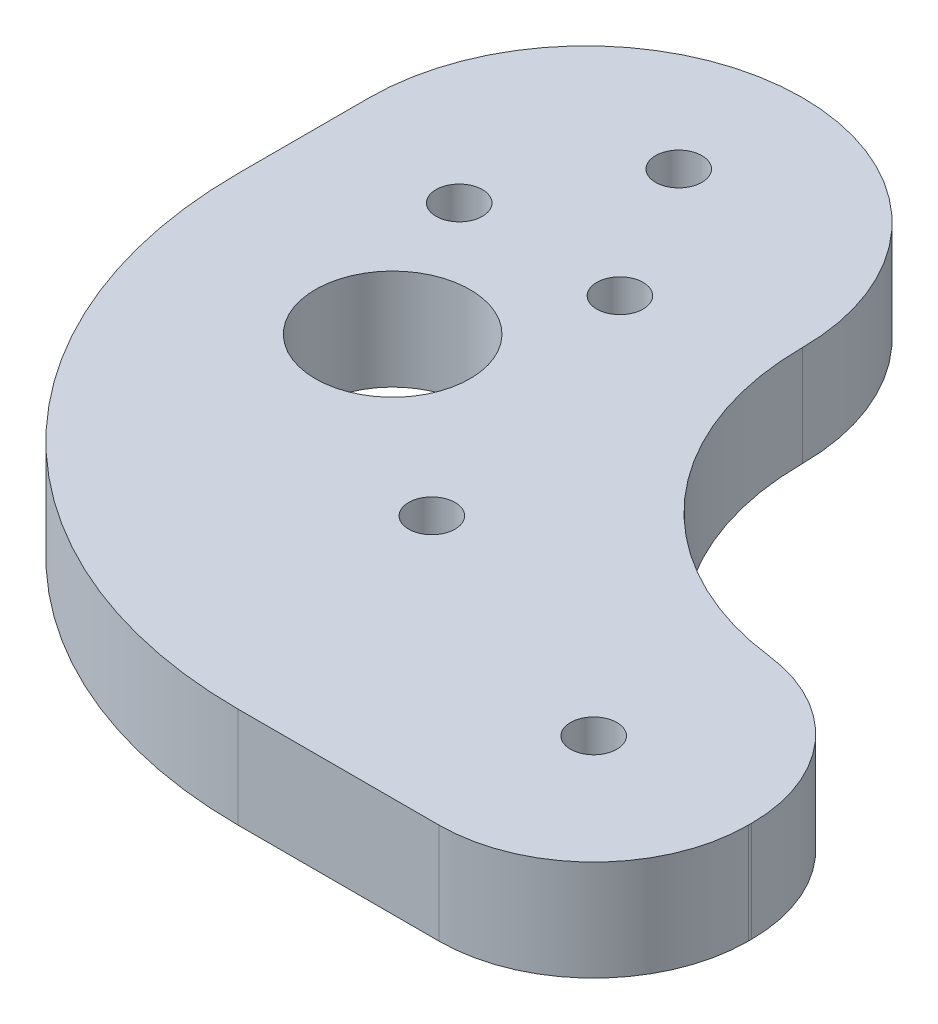
ISO-10303-21;
HEADER;
FILE_DESCRIPTION(('STEP AP214'),'2;1');
FILE_NAME('part.step','',(''),(''),'','','');
FILE_SCHEMA(('AUTOMOTIVE_DESIGN { 1 0 10303 214 1 1 1 1 }'));
ENDSEC;
DATA;
#1=APPLICATION_CONTEXT('core data for automotive mechanical design processes');
#2=APPLICATION_PROTOCOL_DEFINITION('international standard','automotive_design',2000,#1);
#3=PRODUCT_CONTEXT('',#1,'mechanical');
#4=PRODUCT('Part','Part','',(#3));
#5=PRODUCT_RELATED_PRODUCT_CATEGORY('part','',(#4));
#6=PRODUCT_DEFINITION_FORMATION('','',#4);
#7=PRODUCT_DEFINITION_CONTEXT('part definition',#1,'design');
#8=PRODUCT_DEFINITION('design','',#6,#7);
#9=PRODUCT_DEFINITION_SHAPE('','',#8);
#10=(LENGTH_UNIT() NAMED_UNIT(*) SI_UNIT(.MILLI.,.METRE.));
#11=(NAMED_UNIT(*) PLANE_ANGLE_UNIT() SI_UNIT($,.RADIAN.));
#12=(NAMED_UNIT(*) SI_UNIT($,.STERADIAN.) SOLID_ANGLE_UNIT());
#13=UNCERTAINTY_MEASURE_WITH_UNIT(LENGTH_MEASURE(1.E-05),#10,'distance_accuracy_value','');
#14=(GEOMETRIC_REPRESENTATION_CONTEXT(3) GLOBAL_UNCERTAINTY_ASSIGNED_CONTEXT((#13)) GLOBAL_UNIT_ASSIGNED_CONTEXT((#10,
#11,#12)) REPRESENTATION_CONTEXT('',''));
#15=CARTESIAN_POINT('',(0.,0.,0.));
#16=DIRECTION('',(0.,0.,1.));
#17=DIRECTION('',(1.,0.,0.));
#18=AXIS2_PLACEMENT_3D('',#15,#16,#17);
#19=CARTESIAN_POINT('',(14.,0.,-38.5));
#20=DIRECTION('',(0.,1.,0.));
#21=DIRECTION('',(0.,0.,1.));
#22=AXIS2_PLACEMENT_3D('',#19,#20,#21);
#23=PLANE('',#22);
#24=CARTESIAN_POINT('',(19.196152422707,0.,-35.5000000000002));
#25=DIRECTION('',(0.,1.,0.));
#26=DIRECTION('',(0.,0.,1.));
#27=AXIS2_PLACEMENT_3D('',#24,#25,#26);
#28=CIRCLE('',#27,1.50000000000012);
#29=CARTESIAN_POINT('',(19.196152422707,0.,-34.0000000000001));
#30=VERTEX_POINT('',#29);
#31=EDGE_CURVE('E136',#30,#30,#28,.T.);
#32=ORIENTED_EDGE('',*,*,#31,.T.);
#33=EDGE_LOOP('',(#32));
#34=FACE_BOUND('',#33,.T.);
#35=CARTESIAN_POINT('',(43.,0.,-10.));
#36=DIRECTION('',(0.,1.,0.));
#37=DIRECTION('',(0.,0.,1.));
#38=AXIS2_PLACEMENT_3D('',#35,#36,#37);
#39=CIRCLE('',#38,1.5);
#40=CARTESIAN_POINT('',(43.,0.,-8.49999999999999));
#41=VERTEX_POINT('',#40);
#42=EDGE_CURVE('E142',#41,#41,#39,.T.);
#43=ORIENTED_EDGE('',*,*,#42,.T.);
#44=EDGE_LOOP('',(#43));
#45=FACE_BOUND('',#44,.T.);
#46=CARTESIAN_POINT('',(14.,0.,-44.5));
#47=DIRECTION('',(0.,1.,0.));
#48=DIRECTION('',(0.,0.,1.));
#49=AXIS2_PLACEMENT_3D('',#46,#47,#48);
#50=CIRCLE('',#49,1.5);
#51=CARTESIAN_POINT('',(14.,0.,-43.));
#52=VERTEX_POINT('',#51);
#53=EDGE_CURVE('E148',#52,#52,#50,.T.);
#54=ORIENTED_EDGE('',*,*,#53,.T.);
#55=EDGE_LOOP('',(#54));
#56=FACE_BOUND('',#55,.T.);
#57=DIRECTION('',(1.,0.,0.));
#58=VECTOR('',#57,1.);
#59=CARTESIAN_POINT('',(0.,0.,0.));
#60=LINE('',#59,#58);
#61=CARTESIAN_POINT('',(30.,0.,0.));
#62=VERTEX_POINT('',#61);
#63=CARTESIAN_POINT('',(43.,0.,0.));
#64=VERTEX_POINT('',#63);
#65=EDGE_CURVE('E154',#62,#64,#60,.T.);
#66=ORIENTED_EDGE('',*,*,#65,.F.);
#67=CARTESIAN_POINT('',(30.,0.,-30.));
#68=DIRECTION('',(0.,1.,0.));
#69=DIRECTION('',(0.,0.,1.));
#70=AXIS2_PLACEMENT_3D('',#67,#68,#69);
#71=CIRCLE('',#70,30.);
#72=CARTESIAN_POINT('',(0.,0.,-30.));
#73=VERTEX_POINT('',#72);
#74=EDGE_CURVE('E57',#62,#73,#71,.F.);
#75=ORIENTED_EDGE('',*,*,#74,.T.);
#76=DIRECTION('',(0.,0.,1.));
#77=VECTOR('',#76,1.);
#78=CARTESIAN_POINT('',(0.,0.,-38.5));
#79=LINE('',#78,#77);
#80=CARTESIAN_POINT('',(0.,0.,-38.5));
#81=VERTEX_POINT('',#80);
#82=EDGE_CURVE('E152',#81,#73,#79,.T.);
#83=ORIENTED_EDGE('',*,*,#82,.F.);
#84=CARTESIAN_POINT('',(14.,0.,-38.5));
#85=DIRECTION('',(0.,1.,0.));
#86=DIRECTION('',(0.,0.,1.));
#87=AXIS2_PLACEMENT_3D('',#84,#85,#86);
#88=CIRCLE('',#87,14.);
#89=CARTESIAN_POINT('',(28.,0.,-38.5));
#90=VERTEX_POINT('',#89);
#91=EDGE_CURVE('E106',#90,#81,#88,.T.);
#92=ORIENTED_EDGE('',*,*,#91,.F.);
#93=CARTESIAN_POINT('',(46.5,0.,-38.5));
#94=DIRECTION('',(0.,-1.,0.));
#95=DIRECTION('',(0.,0.,1.));
#96=AXIS2_PLACEMENT_3D('',#93,#94,#95);
#97=CIRCLE('',#96,18.5);
#98=CARTESIAN_POINT('',(44.2280701754386,0.,-20.1400344534019));
#99=VERTEX_POINT('',#98);
#100=EDGE_CURVE('E159',#99,#90,#97,.T.);
#101=ORIENTED_EDGE('',*,*,#100,.F.);
#102=CARTESIAN_POINT('',(43.,0.,-10.2157287525381));
#103=DIRECTION('',(0.,1.,0.));
#104=DIRECTION('',(0.,0.,1.));
#105=AXIS2_PLACEMENT_3D('',#102,#103,#104);
#106=CIRCLE('',#105,10.);
#107=CARTESIAN_POINT('',(53.,0.,-10.2157287525381));
#108=VERTEX_POINT('',#107);
#109=EDGE_CURVE('E175',#99,#108,#106,.F.);
#110=ORIENTED_EDGE('',*,*,#109,.T.);
#111=DIRECTION('',(0.,0.,-1.));
#112=VECTOR('',#111,1.);
#113=CARTESIAN_POINT('',(53.,0.,0.));
#114=LINE('',#113,#112);
#115=CARTESIAN_POINT('',(53.,0.,-10.));
#116=VERTEX_POINT('',#115);
#117=EDGE_CURVE('E156',#116,#108,#114,.T.);
#118=ORIENTED_EDGE('',*,*,#117,.F.);
#119=CARTESIAN_POINT('',(43.,0.,-10.));
#120=DIRECTION('',(0.,1.,0.));
#121=DIRECTION('',(0.,0.,1.));
#122=AXIS2_PLACEMENT_3D('',#119,#120,#121);
#123=CIRCLE('',#122,10.);
#124=EDGE_CURVE('E164',#116,#64,#123,.F.);
#125=ORIENTED_EDGE('',*,*,#124,.T.);
#126=EDGE_LOOP('',(#66,#75,#83,#92,#101,#110,#118,#125));
#127=FACE_BOUND('',#126,.T.);
#128=CARTESIAN_POINT('',(25.4412219618611,0.,-17.0931457505077));
#129=DIRECTION('',(0.,1.,0.));
#130=DIRECTION('',(0.,0.,1.));
#131=AXIS2_PLACEMENT_3D('',#128,#129,#130);
#132=CIRCLE('',#131,1.5);
#133=CARTESIAN_POINT('',(25.4412219618611,0.,-15.5931457505077));
#134=VERTEX_POINT('',#133);
#135=EDGE_CURVE('E145',#134,#134,#132,.T.);
#136=ORIENTED_EDGE('',*,*,#135,.T.);
#137=EDGE_LOOP('',(#136));
#138=FACE_BOUND('',#137,.T.);
#139=CARTESIAN_POINT('',(14.,0.,-26.));
#140=DIRECTION('',(0.,1.,0.));
#141=DIRECTION('',(0.,0.,1.));
#142=AXIS2_PLACEMENT_3D('',#139,#140,#141);
#143=CIRCLE('',#142,5.);
#144=CARTESIAN_POINT('',(14.,0.,-21.));
#145=VERTEX_POINT('',#144);
#146=EDGE_CURVE('E139',#145,#145,#143,.T.);
#147=ORIENTED_EDGE('',*,*,#146,.T.);
#148=EDGE_LOOP('',(#147));
#149=FACE_BOUND('',#148,.T.);
#150=CARTESIAN_POINT('',(8.80384757729372,0.,-35.4999999999998));
#151=DIRECTION('',(0.,1.,0.));
#152=DIRECTION('',(0.,0.,1.));
#153=AXIS2_PLACEMENT_3D('',#150,#151,#152);
#154=CIRCLE('',#153,1.50000000000001);
#155=CARTESIAN_POINT('',(8.80384757729372,0.,-33.9999999999998));
#156=VERTEX_POINT('',#155);
#157=EDGE_CURVE('E133',#156,#156,#154,.T.);
#158=ORIENTED_EDGE('',*,*,#157,.T.);
#159=EDGE_LOOP('',(#158));
#160=FACE_BOUND('',#159,.T.);
#161=ADVANCED_FACE('F35',(#34,#45,#56,#127,#138,#149,#160),#23,.F.);
#162=CARTESIAN_POINT('',(14.,3.5,-38.5));
#163=DIRECTION('',(0.,-1.,0.));
#164=DIRECTION('',(0.,0.,-1.));
#165=AXIS2_PLACEMENT_3D('',#162,#163,#164);
#166=CYLINDRICAL_SURFACE('',#165,14.);
#167=ORIENTED_EDGE('',*,*,#91,.T.);
#168=DIRECTION('',(0.,-1.,0.));
#169=VECTOR('',#168,1.);
#170=CARTESIAN_POINT('',(0.,3.5,-38.5));
#171=LINE('',#170,#169);
#172=CARTESIAN_POINT('',(0.,6.5,-38.5));
#173=VERTEX_POINT('',#172);
#174=EDGE_CURVE('E100',#173,#81,#171,.T.);
#175=ORIENTED_EDGE('',*,*,#174,.F.);
#176=CARTESIAN_POINT('',(14.,6.5,-38.5));
#177=DIRECTION('',(0.,1.,0.));
#178=DIRECTION('',(0.,0.,1.));
#179=AXIS2_PLACEMENT_3D('',#176,#177,#178);
#180=CIRCLE('',#179,14.);
#181=CARTESIAN_POINT('',(28.,6.5,-38.5));
#182=VERTEX_POINT('',#181);
#183=EDGE_CURVE('E104',#182,#173,#180,.T.);
#184=ORIENTED_EDGE('',*,*,#183,.F.);
#185=DIRECTION('',(0.,-1.,0.));
#186=VECTOR('',#185,1.);
#187=CARTESIAN_POINT('',(28.,3.5,-38.5));
#188=LINE('',#187,#186);
#189=EDGE_CURVE('E108',#182,#90,#188,.T.);
#190=ORIENTED_EDGE('',*,*,#189,.T.);
#191=EDGE_LOOP('',(#167,#175,#184,#190));
#192=FACE_BOUND('',#191,.T.);
#193=ADVANCED_FACE('F101',(#192),#166,.T.);
#194=CARTESIAN_POINT('',(0.,3.5,-38.5));
#195=DIRECTION('',(1.,0.,0.));
#196=DIRECTION('',(0.,0.,-1.));
#197=AXIS2_PLACEMENT_3D('',#194,#195,#196);
#198=PLANE('',#197);
#199=ORIENTED_EDGE('',*,*,#82,.T.);
#200=DIRECTION('',(0.,-1.,0.));
#201=VECTOR('',#200,1.);
#202=CARTESIAN_POINT('',(0.,3.5,-30.));
#203=LINE('',#202,#201);
#204=CARTESIAN_POINT('',(0.,6.5,-30.));
#205=VERTEX_POINT('',#204);
#206=EDGE_CURVE('E43',#73,#205,#203,.F.);
#207=ORIENTED_EDGE('',*,*,#206,.T.);
#208=DIRECTION('',(0.,0.,1.));
#209=VECTOR('',#208,1.);
#210=CARTESIAN_POINT('',(0.,6.5,-38.5));
#211=LINE('',#210,#209);
#212=EDGE_CURVE('E110',#173,#205,#211,.T.);
#213=ORIENTED_EDGE('',*,*,#212,.F.);
#214=ORIENTED_EDGE('',*,*,#174,.T.);
#215=EDGE_LOOP('',(#199,#207,#213,#214));
#216=FACE_BOUND('',#215,.T.);
#217=ADVANCED_FACE('F111',(#216),#198,.F.);
#218=CARTESIAN_POINT('',(0.,3.5,0.));
#219=DIRECTION('',(0.,0.,-1.));
#220=DIRECTION('',(-1.,0.,0.));
#221=AXIS2_PLACEMENT_3D('',#218,#219,#220);
#222=PLANE('',#221);
#223=DIRECTION('',(1.,0.,0.));
#224=VECTOR('',#223,1.);
#225=CARTESIAN_POINT('',(0.,6.5,0.));
#226=LINE('',#225,#224);
#227=CARTESIAN_POINT('',(30.,6.5,0.));
#228=VERTEX_POINT('',#227);
#229=CARTESIAN_POINT('',(43.,6.5,0.));
#230=VERTEX_POINT('',#229);
#231=EDGE_CURVE('E114',#228,#230,#226,.T.);
#232=ORIENTED_EDGE('',*,*,#231,.F.);
#233=DIRECTION('',(0.,-1.,0.));
#234=VECTOR('',#233,1.);
#235=CARTESIAN_POINT('',(30.,3.5,0.));
#236=LINE('',#235,#234);
#237=EDGE_CURVE('E181',#228,#62,#236,.T.);
#238=ORIENTED_EDGE('',*,*,#237,.T.);
#239=ORIENTED_EDGE('',*,*,#65,.T.);
#240=DIRECTION('',(0.,-1.,0.));
#241=VECTOR('',#240,1.);
#242=CARTESIAN_POINT('',(43.,3.5,0.));
#243=LINE('',#242,#241);
#244=EDGE_CURVE('E167',#64,#230,#243,.F.);
#245=ORIENTED_EDGE('',*,*,#244,.T.);
#246=EDGE_LOOP('',(#232,#238,#239,#245));
#247=FACE_BOUND('',#246,.T.);
#248=ADVANCED_FACE('F187',(#247),#222,.F.);
#249=CARTESIAN_POINT('',(53.,3.5,0.));
#250=DIRECTION('',(-1.,0.,0.));
#251=DIRECTION('',(0.,0.,1.));
#252=AXIS2_PLACEMENT_3D('',#249,#250,#251);
#253=PLANE('',#252);
#254=ORIENTED_EDGE('',*,*,#117,.T.);
#255=DIRECTION('',(0.,-1.,0.));
#256=VECTOR('',#255,1.);
#257=CARTESIAN_POINT('',(53.,3.5,-10.2157287525381));
#258=LINE('',#257,#256);
#259=CARTESIAN_POINT('',(53.,6.5,-10.2157287525381));
#260=VERTEX_POINT('',#259);
#261=EDGE_CURVE('E177',#108,#260,#258,.F.);
#262=ORIENTED_EDGE('',*,*,#261,.T.);
#263=DIRECTION('',(0.,0.,-1.));
#264=VECTOR('',#263,1.);
#265=CARTESIAN_POINT('',(53.,6.5,0.));
#266=LINE('',#265,#264);
#267=CARTESIAN_POINT('',(53.,6.5,-10.));
#268=VERTEX_POINT('',#267);
#269=EDGE_CURVE('E129',#268,#260,#266,.T.);
#270=ORIENTED_EDGE('',*,*,#269,.F.);
#271=DIRECTION('',(0.,-1.,0.));
#272=VECTOR('',#271,1.);
#273=CARTESIAN_POINT('',(53.,3.5,-10.));
#274=LINE('',#273,#272);
#275=EDGE_CURVE('E107',#268,#116,#274,.T.);
#276=ORIENTED_EDGE('',*,*,#275,.T.);
#277=EDGE_LOOP('',(#254,#262,#270,#276));
#278=FACE_BOUND('',#277,.T.);
#279=ADVANCED_FACE('F199',(#278),#253,.F.);
#280=CARTESIAN_POINT('',(46.5,3.5,-38.5));
#281=DIRECTION('',(0.,-1.,0.));
#282=DIRECTION('',(0.,0.,-1.));
#283=AXIS2_PLACEMENT_3D('',#280,#281,#282);
#284=CYLINDRICAL_SURFACE('',#283,18.5);
#285=CARTESIAN_POINT('',(46.5,6.5,-38.5));
#286=DIRECTION('',(0.,-1.,0.));
#287=DIRECTION('',(0.,0.,1.));
#288=AXIS2_PLACEMENT_3D('',#285,#286,#287);
#289=CIRCLE('',#288,18.5);
#290=CARTESIAN_POINT('',(44.2280701754386,6.5,-20.1400344534019));
#291=VERTEX_POINT('',#290);
#292=EDGE_CURVE('E119',#291,#182,#289,.T.);
#293=ORIENTED_EDGE('',*,*,#292,.F.);
#294=DIRECTION('',(0.,-1.,0.));
#295=VECTOR('',#294,1.);
#296=CARTESIAN_POINT('',(44.2280701754386,3.5,-20.1400344534019));
#297=LINE('',#296,#295);
#298=EDGE_CURVE('E172',#291,#99,#297,.T.);
#299=ORIENTED_EDGE('',*,*,#298,.T.);
#300=ORIENTED_EDGE('',*,*,#100,.T.);
#301=ORIENTED_EDGE('',*,*,#189,.F.);
#302=EDGE_LOOP('',(#293,#299,#300,#301));
#303=FACE_BOUND('',#302,.T.);
#304=ADVANCED_FACE('F205',(#303),#284,.F.);
#305=CARTESIAN_POINT('',(14.,3.5,-44.5));
#306=DIRECTION('',(0.,-1.,0.));
#307=DIRECTION('',(0.,0.,-1.));
#308=AXIS2_PLACEMENT_3D('',#305,#306,#307);
#309=CYLINDRICAL_SURFACE('',#308,1.5);
#310=ORIENTED_EDGE('',*,*,#53,.F.);
#311=EDGE_LOOP('',(#310));
#312=FACE_BOUND('',#311,.T.);
#313=CARTESIAN_POINT('',(14.,6.5,-44.5));
#314=DIRECTION('',(0.,1.,0.));
#315=DIRECTION('',(0.,0.,1.));
#316=AXIS2_PLACEMENT_3D('',#313,#314,#315);
#317=CIRCLE('',#316,1.5);
#318=CARTESIAN_POINT('',(14.,6.5,-43.));
#319=VERTEX_POINT('',#318);
#320=EDGE_CURVE('E121',#319,#319,#317,.T.);
#321=ORIENTED_EDGE('',*,*,#320,.T.);
#322=EDGE_LOOP('',(#321));
#323=FACE_BOUND('',#322,.T.);
#324=ADVANCED_FACE('F221',(#312,#323),#309,.F.);
#325=CARTESIAN_POINT('',(25.4412219618611,3.5,-17.0931457505077));
#326=DIRECTION('',(0.,-1.,0.));
#327=DIRECTION('',(0.,0.,-1.));
#328=AXIS2_PLACEMENT_3D('',#325,#326,#327);
#329=CYLINDRICAL_SURFACE('',#328,1.5);
#330=ORIENTED_EDGE('',*,*,#135,.F.);
#331=EDGE_LOOP('',(#330));
#332=FACE_BOUND('',#331,.T.);
#333=CARTESIAN_POINT('',(25.4412219618611,6.5,-17.0931457505077));
#334=DIRECTION('',(0.,1.,0.));
#335=DIRECTION('',(0.,0.,1.));
#336=AXIS2_PLACEMENT_3D('',#333,#334,#335);
#337=CIRCLE('',#336,1.5);
#338=CARTESIAN_POINT('',(25.4412219618611,6.5,-15.5931457505077));
#339=VERTEX_POINT('',#338);
#340=EDGE_CURVE('E124',#339,#339,#337,.T.);
#341=ORIENTED_EDGE('',*,*,#340,.T.);
#342=EDGE_LOOP('',(#341));
#343=FACE_BOUND('',#342,.T.);
#344=ADVANCED_FACE('F256',(#332,#343),#329,.F.);
#345=CARTESIAN_POINT('',(43.,3.5,-10.));
#346=DIRECTION('',(0.,-1.,0.));
#347=DIRECTION('',(0.,0.,-1.));
#348=AXIS2_PLACEMENT_3D('',#345,#346,#347);
#349=CYLINDRICAL_SURFACE('',#348,1.5);
#350=ORIENTED_EDGE('',*,*,#42,.F.);
#351=EDGE_LOOP('',(#350));
#352=FACE_BOUND('',#351,.T.);
#353=CARTESIAN_POINT('',(43.,6.5,-10.));
#354=DIRECTION('',(0.,1.,0.));
#355=DIRECTION('',(0.,0.,1.));
#356=AXIS2_PLACEMENT_3D('',#353,#354,#355);
#357=CIRCLE('',#356,1.5);
#358=CARTESIAN_POINT('',(43.,6.5,-8.49999999999999));
#359=VERTEX_POINT('',#358);
#360=EDGE_CURVE('E268',#359,#359,#357,.T.);
#361=ORIENTED_EDGE('',*,*,#360,.T.);
#362=EDGE_LOOP('',(#361));
#363=FACE_BOUND('',#362,.T.);
#364=ADVANCED_FACE('F253',(#352,#363),#349,.F.);
#365=CARTESIAN_POINT('',(14.,3.5,-26.));
#366=DIRECTION('',(0.,-1.,0.));
#367=DIRECTION('',(0.,0.,-1.));
#368=AXIS2_PLACEMENT_3D('',#365,#366,#367);
#369=CYLINDRICAL_SURFACE('',#368,5.);
#370=ORIENTED_EDGE('',*,*,#146,.F.);
#371=EDGE_LOOP('',(#370));
#372=FACE_BOUND('',#371,.T.);
#373=CARTESIAN_POINT('',(14.,6.5,-26.));
#374=DIRECTION('',(0.,1.,0.));
#375=DIRECTION('',(0.,0.,1.));
#376=AXIS2_PLACEMENT_3D('',#373,#374,#375);
#377=CIRCLE('',#376,5.);
#378=CARTESIAN_POINT('',(14.,6.5,-21.));
#379=VERTEX_POINT('',#378);
#380=EDGE_CURVE('E270',#379,#379,#377,.T.);
#381=ORIENTED_EDGE('',*,*,#380,.T.);
#382=EDGE_LOOP('',(#381));
#383=FACE_BOUND('',#382,.T.);
#384=ADVANCED_FACE('F249',(#372,#383),#369,.F.);
#385=CARTESIAN_POINT('',(19.196152422707,3.5,-35.5000000000002));
#386=DIRECTION('',(0.,-1.,0.));
#387=DIRECTION('',(0.,0.,-1.));
#388=AXIS2_PLACEMENT_3D('',#385,#386,#387);
#389=CYLINDRICAL_SURFACE('',#388,1.50000000000012);
#390=ORIENTED_EDGE('',*,*,#31,.F.);
#391=EDGE_LOOP('',(#390));
#392=FACE_BOUND('',#391,.T.);
#393=CARTESIAN_POINT('',(19.196152422707,6.5,-35.5000000000002));
#394=DIRECTION('',(0.,1.,0.));
#395=DIRECTION('',(0.,0.,1.));
#396=AXIS2_PLACEMENT_3D('',#393,#394,#395);
#397=CIRCLE('',#396,1.50000000000012);
#398=CARTESIAN_POINT('',(19.196152422707,6.5,-34.0000000000001));
#399=VERTEX_POINT('',#398);
#400=EDGE_CURVE('E275',#399,#399,#397,.T.);
#401=ORIENTED_EDGE('',*,*,#400,.T.);
#402=EDGE_LOOP('',(#401));
#403=FACE_BOUND('',#402,.T.);
#404=ADVANCED_FACE('F241',(#392,#403),#389,.F.);
#405=CARTESIAN_POINT('',(8.80384757729372,3.5,-35.4999999999998));
#406=DIRECTION('',(0.,-1.,0.));
#407=DIRECTION('',(0.,0.,-1.));
#408=AXIS2_PLACEMENT_3D('',#405,#406,#407);
#409=CYLINDRICAL_SURFACE('',#408,1.50000000000001);
#410=ORIENTED_EDGE('',*,*,#157,.F.);
#411=EDGE_LOOP('',(#410));
#412=FACE_BOUND('',#411,.T.);
#413=CARTESIAN_POINT('',(8.80384757729372,6.5,-35.4999999999998));
#414=DIRECTION('',(0.,1.,0.));
#415=DIRECTION('',(0.,0.,1.));
#416=AXIS2_PLACEMENT_3D('',#413,#414,#415);
#417=CIRCLE('',#416,1.50000000000001);
#418=CARTESIAN_POINT('',(8.80384757729372,6.5,-33.9999999999998));
#419=VERTEX_POINT('',#418);
#420=EDGE_CURVE('E278',#419,#419,#417,.T.);
#421=ORIENTED_EDGE('',*,*,#420,.T.);
#422=EDGE_LOOP('',(#421));
#423=FACE_BOUND('',#422,.T.);
#424=ADVANCED_FACE('F235',(#412,#423),#409,.F.);
#425=CARTESIAN_POINT('',(14.,6.5,-38.5));
#426=DIRECTION('',(0.,1.,0.));
#427=DIRECTION('',(0.,0.,1.));
#428=AXIS2_PLACEMENT_3D('',#425,#426,#427);
#429=PLANE('',#428);
#430=ORIENTED_EDGE('',*,*,#400,.F.);
#431=EDGE_LOOP('',(#430));
#432=FACE_BOUND('',#431,.T.);
#433=ORIENTED_EDGE('',*,*,#360,.F.);
#434=EDGE_LOOP('',(#433));
#435=FACE_BOUND('',#434,.T.);
#436=ORIENTED_EDGE('',*,*,#320,.F.);
#437=EDGE_LOOP('',(#436));
#438=FACE_BOUND('',#437,.T.);
#439=ORIENTED_EDGE('',*,*,#212,.T.);
#440=CARTESIAN_POINT('',(30.,6.5,-30.));
#441=DIRECTION('',(0.,1.,0.));
#442=DIRECTION('',(0.,0.,1.));
#443=AXIS2_PLACEMENT_3D('',#440,#441,#442);
#444=CIRCLE('',#443,30.);
#445=EDGE_CURVE('E11',#205,#228,#444,.T.);
#446=ORIENTED_EDGE('',*,*,#445,.T.);
#447=ORIENTED_EDGE('',*,*,#231,.T.);
#448=CARTESIAN_POINT('',(43.,6.5,-10.));
#449=DIRECTION('',(0.,1.,0.));
#450=DIRECTION('',(0.,0.,1.));
#451=AXIS2_PLACEMENT_3D('',#448,#449,#450);
#452=CIRCLE('',#451,10.);
#453=EDGE_CURVE('E170',#230,#268,#452,.T.);
#454=ORIENTED_EDGE('',*,*,#453,.T.);
#455=ORIENTED_EDGE('',*,*,#269,.T.);
#456=CARTESIAN_POINT('',(43.,6.5,-10.2157287525381));
#457=DIRECTION('',(0.,1.,0.));
#458=DIRECTION('',(0.,0.,1.));
#459=AXIS2_PLACEMENT_3D('',#456,#457,#458);
#460=CIRCLE('',#459,10.);
#461=EDGE_CURVE('E179',#260,#291,#460,.T.);
#462=ORIENTED_EDGE('',*,*,#461,.T.);
#463=ORIENTED_EDGE('',*,*,#292,.T.);
#464=ORIENTED_EDGE('',*,*,#183,.T.);
#465=EDGE_LOOP('',(#439,#446,#447,#454,#455,#462,#463,#464));
#466=FACE_BOUND('',#465,.T.);
#467=ORIENTED_EDGE('',*,*,#340,.F.);
#468=EDGE_LOOP('',(#467));
#469=FACE_BOUND('',#468,.T.);
#470=ORIENTED_EDGE('',*,*,#380,.F.);
#471=EDGE_LOOP('',(#470));
#472=FACE_BOUND('',#471,.T.);
#473=ORIENTED_EDGE('',*,*,#420,.F.);
#474=EDGE_LOOP('',(#473));
#475=FACE_BOUND('',#474,.T.);
#476=ADVANCED_FACE('F116',(#432,#435,#438,#466,#469,#472,#475),#429,.T.);
#477=CARTESIAN_POINT('',(43.,3.5,-10.));
#478=DIRECTION('',(0.,-1.,0.));
#479=DIRECTION('',(0.,0.,-1.));
#480=AXIS2_PLACEMENT_3D('',#477,#478,#479);
#481=CYLINDRICAL_SURFACE('',#480,10.);
#482=ORIENTED_EDGE('',*,*,#453,.F.);
#483=ORIENTED_EDGE('',*,*,#244,.F.);
#484=ORIENTED_EDGE('',*,*,#124,.F.);
#485=ORIENTED_EDGE('',*,*,#275,.F.);
#486=EDGE_LOOP('',(#482,#483,#484,#485));
#487=FACE_BOUND('',#486,.T.);
#488=ADVANCED_FACE('F195',(#487),#481,.T.);
#489=CARTESIAN_POINT('',(43.,3.5,-10.2157287525381));
#490=DIRECTION('',(0.,-1.,0.));
#491=DIRECTION('',(0.,0.,-1.));
#492=AXIS2_PLACEMENT_3D('',#489,#490,#491);
#493=CYLINDRICAL_SURFACE('',#492,10.);
#494=ORIENTED_EDGE('',*,*,#461,.F.);
#495=ORIENTED_EDGE('',*,*,#261,.F.);
#496=ORIENTED_EDGE('',*,*,#109,.F.);
#497=ORIENTED_EDGE('',*,*,#298,.F.);
#498=EDGE_LOOP('',(#494,#495,#496,#497));
#499=FACE_BOUND('',#498,.T.);
#500=ADVANCED_FACE('F202',(#499),#493,.T.);
#501=CARTESIAN_POINT('',(30.,3.5,-30.));
#502=DIRECTION('',(0.,-1.,0.));
#503=DIRECTION('',(0.,0.,-1.));
#504=AXIS2_PLACEMENT_3D('',#501,#502,#503);
#505=CYLINDRICAL_SURFACE('',#504,30.);
#506=ORIENTED_EDGE('',*,*,#445,.F.);
#507=ORIENTED_EDGE('',*,*,#206,.F.);
#508=ORIENTED_EDGE('',*,*,#74,.F.);
#509=ORIENTED_EDGE('',*,*,#237,.F.);
#510=EDGE_LOOP('',(#506,#507,#508,#509));
#511=FACE_BOUND('',#510,.T.);
#512=ADVANCED_FACE('F37',(#511),#505,.T.);
#513=CLOSED_SHELL('',(#161,#193,#217,#248,#279,#304,#324,#344,#364,#384,#404,#424,#476,#488,
#500,#512));
#514=MANIFOLD_SOLID_BREP('B2',#513);
#515=ADVANCED_BREP_SHAPE_REPRESENTATION('',(#18,#514),#14);
#516=SHAPE_DEFINITION_REPRESENTATION(#9,#515);
ENDSEC;
END-ISO-10303-21;
